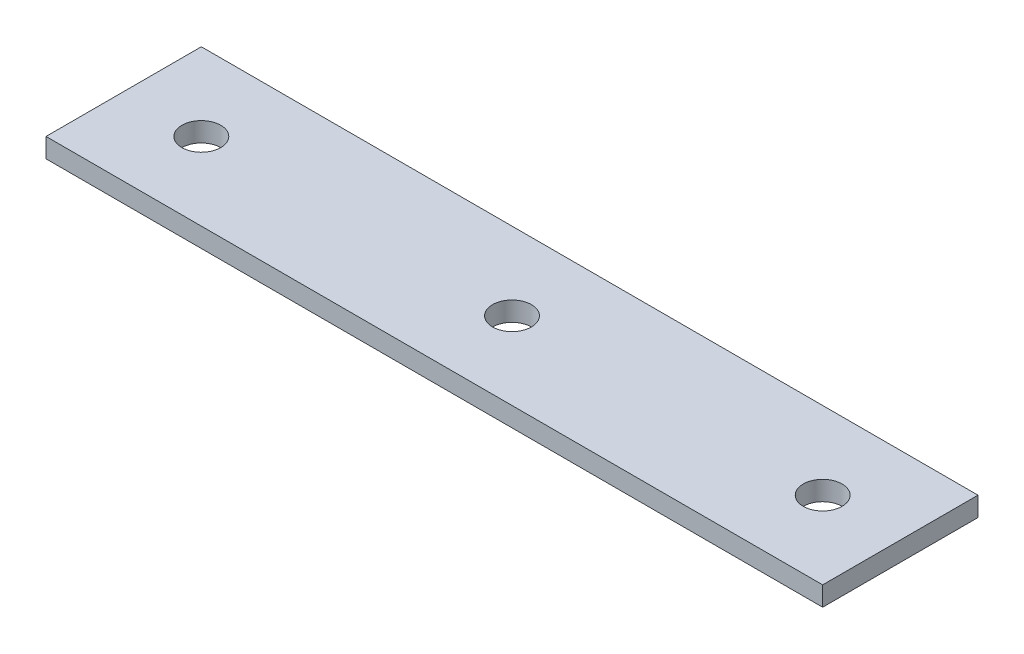
ISO-10303-21;
HEADER;
FILE_DESCRIPTION(('STEP AP214'),'2;1');
FILE_NAME('part.step','',(''),(''),'','','');
FILE_SCHEMA(('AUTOMOTIVE_DESIGN { 1 0 10303 214 1 1 1 1 }'));
ENDSEC;
DATA;
#1=APPLICATION_CONTEXT('core data for automotive mechanical design processes');
#2=APPLICATION_PROTOCOL_DEFINITION('international standard','automotive_design',2000,#1);
#3=PRODUCT_CONTEXT('',#1,'mechanical');
#4=PRODUCT('Part','Part','',(#3));
#5=PRODUCT_RELATED_PRODUCT_CATEGORY('part','',(#4));
#6=PRODUCT_DEFINITION_FORMATION('','',#4);
#7=PRODUCT_DEFINITION_CONTEXT('part definition',#1,'design');
#8=PRODUCT_DEFINITION('design','',#6,#7);
#9=PRODUCT_DEFINITION_SHAPE('','',#8);
#10=(LENGTH_UNIT() NAMED_UNIT(*) SI_UNIT(.MILLI.,.METRE.));
#11=(NAMED_UNIT(*) PLANE_ANGLE_UNIT() SI_UNIT($,.RADIAN.));
#12=(NAMED_UNIT(*) SI_UNIT($,.STERADIAN.) SOLID_ANGLE_UNIT());
#13=UNCERTAINTY_MEASURE_WITH_UNIT(LENGTH_MEASURE(1.E-05),#10,'distance_accuracy_value','');
#14=(GEOMETRIC_REPRESENTATION_CONTEXT(3) GLOBAL_UNCERTAINTY_ASSIGNED_CONTEXT((#13)) GLOBAL_UNIT_ASSIGNED_CONTEXT((#10,
#11,#12)) REPRESENTATION_CONTEXT('',''));
#15=CARTESIAN_POINT('',(0.,0.,0.));
#16=DIRECTION('',(0.,0.,1.));
#17=DIRECTION('',(1.,0.,0.));
#18=AXIS2_PLACEMENT_3D('',#15,#16,#17);
#19=CARTESIAN_POINT('',(0.,3.175,0.));
#20=DIRECTION('',(-1.,0.,0.));
#21=DIRECTION('',(0.,0.,1.));
#22=AXIS2_PLACEMENT_3D('',#19,#20,#21);
#23=PLANE('',#22);
#24=DIRECTION('',(0.,0.,-1.));
#25=VECTOR('',#24,1.);
#26=CARTESIAN_POINT('',(0.,0.,0.));
#27=LINE('',#26,#25);
#28=CARTESIAN_POINT('',(0.,0.,0.));
#29=VERTEX_POINT('',#28);
#30=CARTESIAN_POINT('',(0.,0.,-25.4));
#31=VERTEX_POINT('',#30);
#32=EDGE_CURVE('E102',#29,#31,#27,.T.);
#33=ORIENTED_EDGE('',*,*,#32,.F.);
#34=DIRECTION('',(0.,-1.,0.));
#35=VECTOR('',#34,1.);
#36=CARTESIAN_POINT('',(0.,3.175,0.));
#37=LINE('',#36,#35);
#38=CARTESIAN_POINT('',(0.,3.175,0.));
#39=VERTEX_POINT('',#38);
#40=EDGE_CURVE('E11',#39,#29,#37,.T.);
#41=ORIENTED_EDGE('',*,*,#40,.F.);
#42=DIRECTION('',(0.,0.,-1.));
#43=VECTOR('',#42,1.);
#44=CARTESIAN_POINT('',(0.,3.175,0.));
#45=LINE('',#44,#43);
#46=CARTESIAN_POINT('',(0.,3.175,-25.4));
#47=VERTEX_POINT('',#46);
#48=EDGE_CURVE('E96',#39,#47,#45,.T.);
#49=ORIENTED_EDGE('',*,*,#48,.T.);
#50=DIRECTION('',(0.,-1.,0.));
#51=VECTOR('',#50,1.);
#52=CARTESIAN_POINT('',(0.,3.175,-25.4));
#53=LINE('',#52,#51);
#54=EDGE_CURVE('E37',#47,#31,#53,.T.);
#55=ORIENTED_EDGE('',*,*,#54,.T.);
#56=EDGE_LOOP('',(#33,#41,#49,#55));
#57=FACE_BOUND('',#56,.T.);
#58=ADVANCED_FACE('F34',(#57),#23,.T.);
#59=CARTESIAN_POINT('',(0.,3.175,0.));
#60=DIRECTION('',(0.,0.,-1.));
#61=DIRECTION('',(-1.,0.,0.));
#62=AXIS2_PLACEMENT_3D('',#59,#60,#61);
#63=PLANE('',#62);
#64=DIRECTION('',(1.,0.,0.));
#65=VECTOR('',#64,1.);
#66=CARTESIAN_POINT('',(0.,0.,0.));
#67=LINE('',#66,#65);
#68=CARTESIAN_POINT('',(127.,0.,0.));
#69=VERTEX_POINT('',#68);
#70=EDGE_CURVE('E67',#29,#69,#67,.T.);
#71=ORIENTED_EDGE('',*,*,#70,.T.);
#72=DIRECTION('',(0.,-1.,0.));
#73=VECTOR('',#72,1.);
#74=CARTESIAN_POINT('',(127.,3.175,0.));
#75=LINE('',#74,#73);
#76=CARTESIAN_POINT('',(127.,3.175,0.));
#77=VERTEX_POINT('',#76);
#78=EDGE_CURVE('E43',#77,#69,#75,.T.);
#79=ORIENTED_EDGE('',*,*,#78,.F.);
#80=DIRECTION('',(1.,0.,0.));
#81=VECTOR('',#80,1.);
#82=CARTESIAN_POINT('',(0.,3.175,0.));
#83=LINE('',#82,#81);
#84=EDGE_CURVE('E84',#39,#77,#83,.T.);
#85=ORIENTED_EDGE('',*,*,#84,.F.);
#86=ORIENTED_EDGE('',*,*,#40,.T.);
#87=EDGE_LOOP('',(#71,#79,#85,#86));
#88=FACE_BOUND('',#87,.T.);
#89=ADVANCED_FACE('F189',(#88),#63,.F.);
#90=CARTESIAN_POINT('',(127.,3.175,0.));
#91=DIRECTION('',(-1.,0.,0.));
#92=DIRECTION('',(0.,0.,1.));
#93=AXIS2_PLACEMENT_3D('',#90,#91,#92);
#94=PLANE('',#93);
#95=DIRECTION('',(0.,0.,-1.));
#96=VECTOR('',#95,1.);
#97=CARTESIAN_POINT('',(127.,0.,0.));
#98=LINE('',#97,#96);
#99=CARTESIAN_POINT('',(127.,0.,-25.4));
#100=VERTEX_POINT('',#99);
#101=EDGE_CURVE('E92',#69,#100,#98,.T.);
#102=ORIENTED_EDGE('',*,*,#101,.T.);
#103=DIRECTION('',(0.,-1.,0.));
#104=VECTOR('',#103,1.);
#105=CARTESIAN_POINT('',(127.,3.175,-25.4));
#106=LINE('',#105,#104);
#107=CARTESIAN_POINT('',(127.,3.175,-25.4));
#108=VERTEX_POINT('',#107);
#109=EDGE_CURVE('E89',#108,#100,#106,.T.);
#110=ORIENTED_EDGE('',*,*,#109,.F.);
#111=DIRECTION('',(0.,0.,-1.));
#112=VECTOR('',#111,1.);
#113=CARTESIAN_POINT('',(127.,3.175,0.));
#114=LINE('',#113,#112);
#115=EDGE_CURVE('E79',#77,#108,#114,.T.);
#116=ORIENTED_EDGE('',*,*,#115,.F.);
#117=ORIENTED_EDGE('',*,*,#78,.T.);
#118=EDGE_LOOP('',(#102,#110,#116,#117));
#119=FACE_BOUND('',#118,.T.);
#120=ADVANCED_FACE('F90',(#119),#94,.F.);
#121=CARTESIAN_POINT('',(0.,3.175,-25.4));
#122=DIRECTION('',(0.,0.,-1.));
#123=DIRECTION('',(-1.,0.,0.));
#124=AXIS2_PLACEMENT_3D('',#121,#122,#123);
#125=PLANE('',#124);
#126=DIRECTION('',(1.,0.,0.));
#127=VECTOR('',#126,1.);
#128=CARTESIAN_POINT('',(0.,0.,-25.4));
#129=LINE('',#128,#127);
#130=EDGE_CURVE('E105',#31,#100,#129,.T.);
#131=ORIENTED_EDGE('',*,*,#130,.F.);
#132=ORIENTED_EDGE('',*,*,#54,.F.);
#133=DIRECTION('',(1.,0.,0.));
#134=VECTOR('',#133,1.);
#135=CARTESIAN_POINT('',(0.,3.175,-25.4));
#136=LINE('',#135,#134);
#137=EDGE_CURVE('E83',#47,#108,#136,.T.);
#138=ORIENTED_EDGE('',*,*,#137,.T.);
#139=ORIENTED_EDGE('',*,*,#109,.T.);
#140=EDGE_LOOP('',(#131,#132,#138,#139));
#141=FACE_BOUND('',#140,.T.);
#142=ADVANCED_FACE('F95',(#141),#125,.T.);
#143=CARTESIAN_POINT('',(0.,3.175,0.));
#144=DIRECTION('',(0.,-1.,0.));
#145=DIRECTION('',(0.,0.,-1.));
#146=AXIS2_PLACEMENT_3D('',#143,#144,#145);
#147=PLANE('',#146);
#148=CARTESIAN_POINT('',(63.5,3.175,-12.7));
#149=DIRECTION('',(0.,1.,0.));
#150=DIRECTION('',(0.,0.,1.));
#151=AXIS2_PLACEMENT_3D('',#148,#149,#150);
#152=CIRCLE('',#151,3.175);
#153=CARTESIAN_POINT('',(63.5,3.175,-9.525));
#154=VERTEX_POINT('',#153);
#155=EDGE_CURVE('E154',#154,#154,#152,.T.);
#156=ORIENTED_EDGE('',*,*,#155,.F.);
#157=EDGE_LOOP('',(#156));
#158=FACE_BOUND('',#157,.T.);
#159=CARTESIAN_POINT('',(114.3,3.175,-12.7));
#160=DIRECTION('',(0.,1.,0.));
#161=DIRECTION('',(0.,0.,1.));
#162=AXIS2_PLACEMENT_3D('',#159,#160,#161);
#163=CIRCLE('',#162,3.175);
#164=CARTESIAN_POINT('',(114.3,3.175,-9.525));
#165=VERTEX_POINT('',#164);
#166=EDGE_CURVE('E140',#165,#165,#163,.T.);
#167=ORIENTED_EDGE('',*,*,#166,.F.);
#168=EDGE_LOOP('',(#167));
#169=FACE_BOUND('',#168,.T.);
#170=CARTESIAN_POINT('',(12.7,3.175,-12.7));
#171=DIRECTION('',(0.,1.,0.));
#172=DIRECTION('',(0.,0.,1.));
#173=AXIS2_PLACEMENT_3D('',#170,#171,#172);
#174=CIRCLE('',#173,3.175);
#175=CARTESIAN_POINT('',(12.7,3.175,-9.525));
#176=VERTEX_POINT('',#175);
#177=EDGE_CURVE('E139',#176,#176,#174,.T.);
#178=ORIENTED_EDGE('',*,*,#177,.F.);
#179=EDGE_LOOP('',(#178));
#180=FACE_BOUND('',#179,.T.);
#181=ORIENTED_EDGE('',*,*,#48,.F.);
#182=ORIENTED_EDGE('',*,*,#84,.T.);
#183=ORIENTED_EDGE('',*,*,#115,.T.);
#184=ORIENTED_EDGE('',*,*,#137,.F.);
#185=EDGE_LOOP('',(#181,#182,#183,#184));
#186=FACE_BOUND('',#185,.T.);
#187=ADVANCED_FACE('F82',(#158,#169,#180,#186),#147,.F.);
#188=CARTESIAN_POINT('',(0.,0.,0.));
#189=DIRECTION('',(0.,-1.,0.));
#190=DIRECTION('',(0.,0.,-1.));
#191=AXIS2_PLACEMENT_3D('',#188,#189,#190);
#192=PLANE('',#191);
#193=CARTESIAN_POINT('',(63.5,0.,-12.7));
#194=DIRECTION('',(0.,1.,0.));
#195=DIRECTION('',(0.,0.,1.));
#196=AXIS2_PLACEMENT_3D('',#193,#194,#195);
#197=CIRCLE('',#196,3.175);
#198=CARTESIAN_POINT('',(63.5,0.,-9.525));
#199=VERTEX_POINT('',#198);
#200=EDGE_CURVE('E152',#199,#199,#197,.T.);
#201=ORIENTED_EDGE('',*,*,#200,.T.);
#202=EDGE_LOOP('',(#201));
#203=FACE_BOUND('',#202,.T.);
#204=CARTESIAN_POINT('',(114.3,0.,-12.7));
#205=DIRECTION('',(0.,1.,0.));
#206=DIRECTION('',(0.,0.,1.));
#207=AXIS2_PLACEMENT_3D('',#204,#205,#206);
#208=CIRCLE('',#207,3.175);
#209=CARTESIAN_POINT('',(114.3,0.,-9.525));
#210=VERTEX_POINT('',#209);
#211=EDGE_CURVE('E135',#210,#210,#208,.T.);
#212=ORIENTED_EDGE('',*,*,#211,.T.);
#213=EDGE_LOOP('',(#212));
#214=FACE_BOUND('',#213,.T.);
#215=CARTESIAN_POINT('',(12.7,0.,-12.7));
#216=DIRECTION('',(0.,1.,0.));
#217=DIRECTION('',(0.,0.,1.));
#218=AXIS2_PLACEMENT_3D('',#215,#216,#217);
#219=CIRCLE('',#218,3.175);
#220=CARTESIAN_POINT('',(12.7,0.,-9.525));
#221=VERTEX_POINT('',#220);
#222=EDGE_CURVE('E106',#221,#221,#219,.T.);
#223=ORIENTED_EDGE('',*,*,#222,.T.);
#224=EDGE_LOOP('',(#223));
#225=FACE_BOUND('',#224,.T.);
#226=ORIENTED_EDGE('',*,*,#32,.T.);
#227=ORIENTED_EDGE('',*,*,#130,.T.);
#228=ORIENTED_EDGE('',*,*,#101,.F.);
#229=ORIENTED_EDGE('',*,*,#70,.F.);
#230=EDGE_LOOP('',(#226,#227,#228,#229));
#231=FACE_BOUND('',#230,.T.);
#232=ADVANCED_FACE('F115',(#203,#214,#225,#231),#192,.T.);
#233=CARTESIAN_POINT('',(12.7,0.,-12.7));
#234=DIRECTION('',(0.,1.,0.));
#235=DIRECTION('',(0.,0.,1.));
#236=AXIS2_PLACEMENT_3D('',#233,#234,#235);
#237=CYLINDRICAL_SURFACE('',#236,3.175);
#238=ORIENTED_EDGE('',*,*,#222,.F.);
#239=EDGE_LOOP('',(#238));
#240=FACE_BOUND('',#239,.T.);
#241=ORIENTED_EDGE('',*,*,#177,.T.);
#242=EDGE_LOOP('',(#241));
#243=FACE_BOUND('',#242,.T.);
#244=ADVANCED_FACE('F178',(#240,#243),#237,.F.);
#245=CARTESIAN_POINT('',(114.3,0.,-12.7));
#246=DIRECTION('',(0.,1.,0.));
#247=DIRECTION('',(0.,0.,1.));
#248=AXIS2_PLACEMENT_3D('',#245,#246,#247);
#249=CYLINDRICAL_SURFACE('',#248,3.175);
#250=ORIENTED_EDGE('',*,*,#211,.F.);
#251=EDGE_LOOP('',(#250));
#252=FACE_BOUND('',#251,.T.);
#253=ORIENTED_EDGE('',*,*,#166,.T.);
#254=EDGE_LOOP('',(#253));
#255=FACE_BOUND('',#254,.T.);
#256=ADVANCED_FACE('F170',(#252,#255),#249,.F.);
#257=CARTESIAN_POINT('',(63.5,0.,-12.7));
#258=DIRECTION('',(0.,1.,0.));
#259=DIRECTION('',(0.,0.,1.));
#260=AXIS2_PLACEMENT_3D('',#257,#258,#259);
#261=CYLINDRICAL_SURFACE('',#260,3.175);
#262=ORIENTED_EDGE('',*,*,#200,.F.);
#263=EDGE_LOOP('',(#262));
#264=FACE_BOUND('',#263,.T.);
#265=ORIENTED_EDGE('',*,*,#155,.T.);
#266=EDGE_LOOP('',(#265));
#267=FACE_BOUND('',#266,.T.);
#268=ADVANCED_FACE('F167',(#264,#267),#261,.F.);
#269=CLOSED_SHELL('',(#58,#89,#120,#142,#187,#232,#244,#256,#268));
#270=MANIFOLD_SOLID_BREP('B2',#269);
#271=ADVANCED_BREP_SHAPE_REPRESENTATION('',(#18,#270),#14);
#272=SHAPE_DEFINITION_REPRESENTATION(#9,#271);
ENDSEC;
END-ISO-10303-21;
